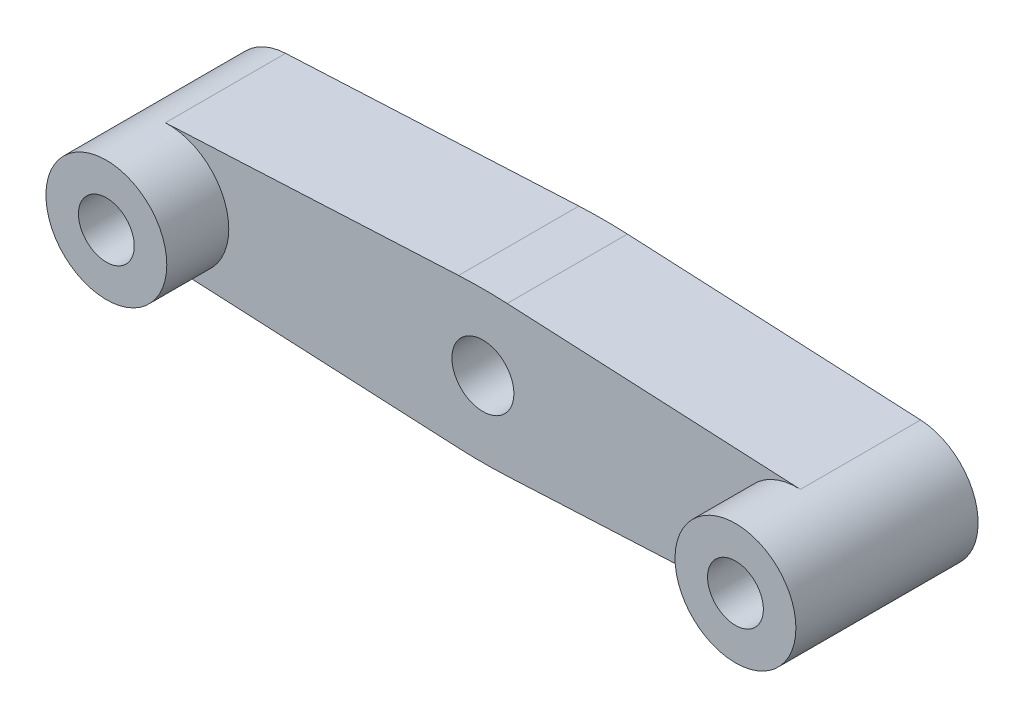
ISO-10303-21;
HEADER;
FILE_DESCRIPTION(('STEP AP214'),'2;1');
FILE_NAME('part.step','',(''),(''),'','','');
FILE_SCHEMA(('AUTOMOTIVE_DESIGN { 1 0 10303 214 1 1 1 1 }'));
ENDSEC;
DATA;
#1=APPLICATION_CONTEXT('core data for automotive mechanical design processes');
#2=APPLICATION_PROTOCOL_DEFINITION('international standard','automotive_design',2000,#1);
#3=PRODUCT_CONTEXT('',#1,'mechanical');
#4=PRODUCT('Part','Part','',(#3));
#5=PRODUCT_RELATED_PRODUCT_CATEGORY('part','',(#4));
#6=PRODUCT_DEFINITION_FORMATION('','',#4);
#7=PRODUCT_DEFINITION_CONTEXT('part definition',#1,'design');
#8=PRODUCT_DEFINITION('design','',#6,#7);
#9=PRODUCT_DEFINITION_SHAPE('','',#8);
#10=(LENGTH_UNIT() NAMED_UNIT(*) SI_UNIT(.MILLI.,.METRE.));
#11=(NAMED_UNIT(*) PLANE_ANGLE_UNIT() SI_UNIT($,.RADIAN.));
#12=(NAMED_UNIT(*) SI_UNIT($,.STERADIAN.) SOLID_ANGLE_UNIT());
#13=UNCERTAINTY_MEASURE_WITH_UNIT(LENGTH_MEASURE(1.E-05),#10,'distance_accuracy_value','');
#14=(GEOMETRIC_REPRESENTATION_CONTEXT(3) GLOBAL_UNCERTAINTY_ASSIGNED_CONTEXT((#13)) GLOBAL_UNIT_ASSIGNED_CONTEXT((#10,
#11,#12)) REPRESENTATION_CONTEXT('',''));
#15=CARTESIAN_POINT('',(0.,0.,0.));
#16=DIRECTION('',(0.,0.,1.));
#17=DIRECTION('',(1.,0.,0.));
#18=AXIS2_PLACEMENT_3D('',#15,#16,#17);
#19=CARTESIAN_POINT('',(0.,0.,0.));
#20=DIRECTION('',(0.,0.,1.));
#21=DIRECTION('',(1.,0.,0.));
#22=AXIS2_PLACEMENT_3D('',#19,#20,#21);
#23=PLANE('',#22);
#24=CARTESIAN_POINT('',(50.75,0.,0.));
#25=DIRECTION('',(0.,0.,-1.));
#26=DIRECTION('',(-1.,0.,0.));
#27=AXIS2_PLACEMENT_3D('',#24,#25,#26);
#28=CIRCLE('',#27,7.5);
#29=CARTESIAN_POINT('',(43.25,0.,0.));
#30=VERTEX_POINT('',#29);
#31=EDGE_CURVE('E214',#30,#30,#28,.T.);
#32=ORIENTED_EDGE('',*,*,#31,.F.);
#33=EDGE_LOOP('',(#32));
#34=FACE_BOUND('',#33,.T.);
#35=CARTESIAN_POINT('',(0.,0.,0.));
#36=DIRECTION('',(0.,0.,1.));
#37=DIRECTION('',(1.,0.,0.));
#38=AXIS2_PLACEMENT_3D('',#35,#36,#37);
#39=CIRCLE('',#38,5.);
#40=CARTESIAN_POINT('',(5.,0.,0.));
#41=VERTEX_POINT('',#40);
#42=EDGE_CURVE('E190',#41,#41,#39,.T.);
#43=ORIENTED_EDGE('',*,*,#42,.T.);
#44=EDGE_LOOP('',(#43));
#45=FACE_BOUND('',#44,.T.);
#46=DIRECTION('',(-0.998800177704476,-0.0489714714656123,0.));
#47=VECTOR('',#46,1.);
#48=CARTESIAN_POINT('',(0.599180751428215,-12.2206219885355,0.));
#49=LINE('',#48,#47);
#50=CARTESIAN_POINT('',(51.2274718467897,-9.73830173261864,0.));
#51=VERTEX_POINT('',#50);
#52=CARTESIAN_POINT('',(3.91771771724899,-12.0579131284883,0.));
#53=VERTEX_POINT('',#52);
#54=EDGE_CURVE('E136',#51,#53,#49,.T.);
#55=ORIENTED_EDGE('',*,*,#54,.T.);
#56=CARTESIAN_POINT('',(0.,67.8461010878698,0.));
#57=DIRECTION('',(0.,0.,1.));
#58=DIRECTION('',(1.,0.,0.));
#59=AXIS2_PLACEMENT_3D('',#56,#57,#58);
#60=CIRCLE('',#59,80.);
#61=CARTESIAN_POINT('',(-3.91771771724899,-12.0579131284883,0.));
#62=VERTEX_POINT('',#61);
#63=EDGE_CURVE('E154',#53,#62,#60,.F.);
#64=ORIENTED_EDGE('',*,*,#63,.T.);
#65=DIRECTION('',(0.998800177704476,-0.0489714714656123,0.));
#66=VECTOR('',#65,1.);
#67=CARTESIAN_POINT('',(-0.599180751428215,-12.2206219885355,0.));
#68=LINE('',#67,#66);
#69=CARTESIAN_POINT('',(-51.2274718467897,-9.73830173261864,0.));
#70=VERTEX_POINT('',#69);
#71=EDGE_CURVE('E133',#70,#62,#68,.T.);
#72=ORIENTED_EDGE('',*,*,#71,.F.);
#73=CARTESIAN_POINT('',(-50.75,0.,0.));
#74=DIRECTION('',(0.,0.,1.));
#75=DIRECTION('',(1.,0.,0.));
#76=AXIS2_PLACEMENT_3D('',#73,#74,#75);
#77=CIRCLE('',#76,9.75);
#78=CARTESIAN_POINT('',(-51.2274718467897,9.73830173261864,0.));
#79=VERTEX_POINT('',#78);
#80=EDGE_CURVE('E130',#79,#70,#77,.T.);
#81=ORIENTED_EDGE('',*,*,#80,.F.);
#82=DIRECTION('',(0.998800177704476,0.0489714714656123,0.));
#83=VECTOR('',#82,1.);
#84=CARTESIAN_POINT('',(-0.599180751428215,12.2206219885355,0.));
#85=LINE('',#84,#83);
#86=CARTESIAN_POINT('',(-3.91771771724899,12.0579131284883,0.));
#87=VERTEX_POINT('',#86);
#88=EDGE_CURVE('E127',#79,#87,#85,.T.);
#89=ORIENTED_EDGE('',*,*,#88,.T.);
#90=CARTESIAN_POINT('',(0.,-67.8461010878698,0.));
#91=DIRECTION('',(0.,0.,1.));
#92=DIRECTION('',(1.,0.,0.));
#93=AXIS2_PLACEMENT_3D('',#90,#91,#92);
#94=CIRCLE('',#93,80.);
#95=CARTESIAN_POINT('',(3.91771771724899,12.0579131284883,0.));
#96=VERTEX_POINT('',#95);
#97=EDGE_CURVE('E152',#87,#96,#94,.F.);
#98=ORIENTED_EDGE('',*,*,#97,.T.);
#99=DIRECTION('',(-0.998800177704476,0.0489714714656123,0.));
#100=VECTOR('',#99,1.);
#101=CARTESIAN_POINT('',(0.599180751428215,12.2206219885355,0.));
#102=LINE('',#101,#100);
#103=CARTESIAN_POINT('',(51.2274718467897,9.73830173261864,0.));
#104=VERTEX_POINT('',#103);
#105=EDGE_CURVE('E140',#104,#96,#102,.T.);
#106=ORIENTED_EDGE('',*,*,#105,.F.);
#107=CARTESIAN_POINT('',(50.75,0.,0.));
#108=DIRECTION('',(0.,0.,1.));
#109=DIRECTION('',(1.,0.,0.));
#110=AXIS2_PLACEMENT_3D('',#107,#108,#109);
#111=CIRCLE('',#110,9.75);
#112=EDGE_CURVE('E117',#104,#51,#111,.F.);
#113=ORIENTED_EDGE('',*,*,#112,.T.);
#114=EDGE_LOOP('',(#55,#64,#72,#81,#89,#98,#106,#113));
#115=FACE_BOUND('',#114,.T.);
#116=CARTESIAN_POINT('',(-50.75,0.,0.));
#117=DIRECTION('',(0.,0.,-1.));
#118=DIRECTION('',(-1.,0.,0.));
#119=AXIS2_PLACEMENT_3D('',#116,#117,#118);
#120=CIRCLE('',#119,7.5);
#121=CARTESIAN_POINT('',(-58.25,0.,0.));
#122=VERTEX_POINT('',#121);
#123=EDGE_CURVE('E202',#122,#122,#120,.T.);
#124=ORIENTED_EDGE('',*,*,#123,.F.);
#125=EDGE_LOOP('',(#124));
#126=FACE_BOUND('',#125,.T.);
#127=ADVANCED_FACE('F36',(#34,#45,#115,#126),#23,.F.);
#128=CARTESIAN_POINT('',(-0.599180751428215,12.2206219885355,19.4));
#129=DIRECTION('',(-0.0489714714656123,0.998800177704476,0.));
#130=DIRECTION('',(-0.998800177704476,-0.0489714714656123,0.));
#131=AXIS2_PLACEMENT_3D('',#128,#129,#130);
#132=PLANE('',#131);
#133=DIRECTION('',(0.998800177704476,0.0489714714656123,0.));
#134=VECTOR('',#133,1.);
#135=CARTESIAN_POINT('',(-0.599180751428215,12.2206219885355,19.4));
#136=LINE('',#135,#134);
#137=CARTESIAN_POINT('',(-51.2274718467897,9.73830173261864,19.4));
#138=VERTEX_POINT('',#137);
#139=CARTESIAN_POINT('',(-3.91771771724899,12.0579131284883,19.4));
#140=VERTEX_POINT('',#139);
#141=EDGE_CURVE('E141',#138,#140,#136,.T.);
#142=ORIENTED_EDGE('',*,*,#141,.T.);
#143=DIRECTION('',(0.,0.,-1.));
#144=VECTOR('',#143,1.);
#145=CARTESIAN_POINT('',(-3.91771771724899,12.0579131284883,0.));
#146=LINE('',#145,#144);
#147=EDGE_CURVE('E44',#140,#87,#146,.T.);
#148=ORIENTED_EDGE('',*,*,#147,.T.);
#149=ORIENTED_EDGE('',*,*,#88,.F.);
#150=DIRECTION('',(0.,0.,-1.));
#151=VECTOR('',#150,1.);
#152=CARTESIAN_POINT('',(-51.2274718467897,9.73830173261864,19.4));
#153=LINE('',#152,#151);
#154=EDGE_CURVE('E147',#138,#79,#153,.T.);
#155=ORIENTED_EDGE('',*,*,#154,.F.);
#156=EDGE_LOOP('',(#142,#148,#149,#155));
#157=FACE_BOUND('',#156,.T.);
#158=ADVANCED_FACE('F164',(#157),#132,.T.);
#159=CARTESIAN_POINT('',(-50.75,0.,19.4));
#160=DIRECTION('',(0.,0.,-1.));
#161=DIRECTION('',(-1.,0.,0.));
#162=AXIS2_PLACEMENT_3D('',#159,#160,#161);
#163=CYLINDRICAL_SURFACE('',#162,9.75);
#164=ORIENTED_EDGE('',*,*,#80,.T.);
#165=DIRECTION('',(0.,0.,-1.));
#166=VECTOR('',#165,1.);
#167=CARTESIAN_POINT('',(-51.2274718467897,-9.73830173261864,19.4));
#168=LINE('',#167,#166);
#169=CARTESIAN_POINT('',(-51.2274718467897,-9.73830173261864,19.4));
#170=VERTEX_POINT('',#169);
#171=EDGE_CURVE('E144',#170,#70,#168,.T.);
#172=ORIENTED_EDGE('',*,*,#171,.F.);
#173=CARTESIAN_POINT('',(-50.75,0.,19.4));
#174=DIRECTION('',(0.,0.,1.));
#175=DIRECTION('',(1.,0.,0.));
#176=AXIS2_PLACEMENT_3D('',#173,#174,#175);
#177=CIRCLE('',#176,9.75);
#178=EDGE_CURVE('E131',#138,#170,#177,.F.);
#179=ORIENTED_EDGE('',*,*,#178,.F.);
#180=ORIENTED_EDGE('',*,*,#154,.T.);
#181=EDGE_LOOP('',(#164,#172,#179,#180));
#182=FACE_BOUND('',#181,.T.);
#183=CARTESIAN_POINT('',(-50.75,0.,29.4));
#184=DIRECTION('',(0.,0.,1.));
#185=DIRECTION('',(1.,0.,0.));
#186=AXIS2_PLACEMENT_3D('',#183,#184,#185);
#187=CIRCLE('',#186,9.75);
#188=CARTESIAN_POINT('',(-41.,0.,29.4));
#189=VERTEX_POINT('',#188);
#190=EDGE_CURVE('E109',#189,#189,#187,.T.);
#191=ORIENTED_EDGE('',*,*,#190,.F.);
#192=EDGE_LOOP('',(#191));
#193=FACE_BOUND('',#192,.T.);
#194=ADVANCED_FACE('F173',(#182,#193),#163,.T.);
#195=CARTESIAN_POINT('',(-0.599180751428215,-12.2206219885355,19.4));
#196=DIRECTION('',(0.0489714714656123,0.998800177704476,0.));
#197=DIRECTION('',(-0.998800177704476,0.0489714714656123,0.));
#198=AXIS2_PLACEMENT_3D('',#195,#196,#197);
#199=PLANE('',#198);
#200=ORIENTED_EDGE('',*,*,#71,.T.);
#201=DIRECTION('',(0.,0.,-1.));
#202=VECTOR('',#201,1.);
#203=CARTESIAN_POINT('',(-3.91771771724899,-12.0579131284883,19.4));
#204=LINE('',#203,#202);
#205=CARTESIAN_POINT('',(-3.91771771724899,-12.0579131284883,19.4));
#206=VERTEX_POINT('',#205);
#207=EDGE_CURVE('E156',#62,#206,#204,.F.);
#208=ORIENTED_EDGE('',*,*,#207,.T.);
#209=DIRECTION('',(0.998800177704476,-0.0489714714656123,0.));
#210=VECTOR('',#209,1.);
#211=CARTESIAN_POINT('',(-0.599180751428215,-12.2206219885355,19.4));
#212=LINE('',#211,#210);
#213=EDGE_CURVE('E123',#170,#206,#212,.T.);
#214=ORIENTED_EDGE('',*,*,#213,.F.);
#215=ORIENTED_EDGE('',*,*,#171,.T.);
#216=EDGE_LOOP('',(#200,#208,#214,#215));
#217=FACE_BOUND('',#216,.T.);
#218=ADVANCED_FACE('F177',(#217),#199,.F.);
#219=CARTESIAN_POINT('',(0.599180751428215,-12.2206219885355,19.4));
#220=DIRECTION('',(0.0489714714656123,-0.998800177704476,0.));
#221=DIRECTION('',(0.998800177704476,0.0489714714656123,0.));
#222=AXIS2_PLACEMENT_3D('',#219,#220,#221);
#223=PLANE('',#222);
#224=DIRECTION('',(-0.998800177704476,-0.0489714714656123,0.));
#225=VECTOR('',#224,1.);
#226=CARTESIAN_POINT('',(0.599180751428215,-12.2206219885355,19.4));
#227=LINE('',#226,#225);
#228=CARTESIAN_POINT('',(51.2274718467897,-9.73830173261864,19.4));
#229=VERTEX_POINT('',#228);
#230=CARTESIAN_POINT('',(3.91771771724899,-12.0579131284883,19.4));
#231=VERTEX_POINT('',#230);
#232=EDGE_CURVE('E106',#229,#231,#227,.T.);
#233=ORIENTED_EDGE('',*,*,#232,.T.);
#234=DIRECTION('',(0.,0.,-1.));
#235=VECTOR('',#234,1.);
#236=CARTESIAN_POINT('',(3.91771771724899,-12.0579131284883,0.));
#237=LINE('',#236,#235);
#238=EDGE_CURVE('E149',#231,#53,#237,.T.);
#239=ORIENTED_EDGE('',*,*,#238,.T.);
#240=ORIENTED_EDGE('',*,*,#54,.F.);
#241=DIRECTION('',(0.,0.,-1.));
#242=VECTOR('',#241,1.);
#243=CARTESIAN_POINT('',(51.2274718467897,-9.73830173261864,19.4));
#244=LINE('',#243,#242);
#245=EDGE_CURVE('E119',#229,#51,#244,.T.);
#246=ORIENTED_EDGE('',*,*,#245,.F.);
#247=EDGE_LOOP('',(#233,#239,#240,#246));
#248=FACE_BOUND('',#247,.T.);
#249=ADVANCED_FACE('F254',(#248),#223,.T.);
#250=CARTESIAN_POINT('',(50.75,0.,19.4));
#251=DIRECTION('',(0.,0.,-1.));
#252=DIRECTION('',(-1.,0.,0.));
#253=AXIS2_PLACEMENT_3D('',#250,#251,#252);
#254=CYLINDRICAL_SURFACE('',#253,9.75);
#255=ORIENTED_EDGE('',*,*,#112,.F.);
#256=DIRECTION('',(0.,0.,-1.));
#257=VECTOR('',#256,1.);
#258=CARTESIAN_POINT('',(51.2274718467897,9.73830173261864,19.4));
#259=LINE('',#258,#257);
#260=CARTESIAN_POINT('',(51.2274718467897,9.73830173261864,19.4));
#261=VERTEX_POINT('',#260);
#262=EDGE_CURVE('E113',#261,#104,#259,.T.);
#263=ORIENTED_EDGE('',*,*,#262,.F.);
#264=CARTESIAN_POINT('',(50.75,0.,19.4));
#265=DIRECTION('',(0.,0.,1.));
#266=DIRECTION('',(1.,0.,0.));
#267=AXIS2_PLACEMENT_3D('',#264,#265,#266);
#268=CIRCLE('',#267,9.75);
#269=EDGE_CURVE('E100',#261,#229,#268,.T.);
#270=ORIENTED_EDGE('',*,*,#269,.T.);
#271=ORIENTED_EDGE('',*,*,#245,.T.);
#272=EDGE_LOOP('',(#255,#263,#270,#271));
#273=FACE_BOUND('',#272,.T.);
#274=CARTESIAN_POINT('',(50.75,0.,29.4));
#275=DIRECTION('',(0.,0.,1.));
#276=DIRECTION('',(1.,0.,0.));
#277=AXIS2_PLACEMENT_3D('',#274,#275,#276);
#278=CIRCLE('',#277,9.75);
#279=CARTESIAN_POINT('',(60.5,0.,29.4));
#280=VERTEX_POINT('',#279);
#281=EDGE_CURVE('E110',#280,#280,#278,.F.);
#282=ORIENTED_EDGE('',*,*,#281,.T.);
#283=EDGE_LOOP('',(#282));
#284=FACE_BOUND('',#283,.T.);
#285=ADVANCED_FACE('F114',(#273,#284),#254,.T.);
#286=CARTESIAN_POINT('',(0.599180751428215,12.2206219885355,19.4));
#287=DIRECTION('',(-0.0489714714656123,-0.998800177704476,0.));
#288=DIRECTION('',(0.998800177704476,-0.0489714714656123,0.));
#289=AXIS2_PLACEMENT_3D('',#286,#287,#288);
#290=PLANE('',#289);
#291=ORIENTED_EDGE('',*,*,#105,.T.);
#292=DIRECTION('',(0.,0.,-1.));
#293=VECTOR('',#292,1.);
#294=CARTESIAN_POINT('',(3.91771771724899,12.0579131284883,19.4));
#295=LINE('',#294,#293);
#296=CARTESIAN_POINT('',(3.91771771724899,12.0579131284883,19.4));
#297=VERTEX_POINT('',#296);
#298=EDGE_CURVE('E11',#96,#297,#295,.F.);
#299=ORIENTED_EDGE('',*,*,#298,.T.);
#300=DIRECTION('',(-0.998800177704476,0.0489714714656123,0.));
#301=VECTOR('',#300,1.);
#302=CARTESIAN_POINT('',(0.599180751428215,12.2206219885355,19.4));
#303=LINE('',#302,#301);
#304=EDGE_CURVE('E104',#261,#297,#303,.T.);
#305=ORIENTED_EDGE('',*,*,#304,.F.);
#306=ORIENTED_EDGE('',*,*,#262,.T.);
#307=EDGE_LOOP('',(#291,#299,#305,#306));
#308=FACE_BOUND('',#307,.T.);
#309=ADVANCED_FACE('F121',(#308),#290,.F.);
#310=CARTESIAN_POINT('',(0.,0.,19.4));
#311=DIRECTION('',(0.,0.,1.));
#312=DIRECTION('',(1.,0.,0.));
#313=AXIS2_PLACEMENT_3D('',#310,#311,#312);
#314=PLANE('',#313);
#315=CARTESIAN_POINT('',(0.,0.,19.4));
#316=DIRECTION('',(0.,0.,1.));
#317=DIRECTION('',(1.,0.,0.));
#318=AXIS2_PLACEMENT_3D('',#315,#316,#317);
#319=CIRCLE('',#318,5.);
#320=CARTESIAN_POINT('',(5.,0.,19.4));
#321=VERTEX_POINT('',#320);
#322=EDGE_CURVE('E187',#321,#321,#319,.F.);
#323=ORIENTED_EDGE('',*,*,#322,.T.);
#324=EDGE_LOOP('',(#323));
#325=FACE_BOUND('',#324,.T.);
#326=ORIENTED_EDGE('',*,*,#213,.T.);
#327=CARTESIAN_POINT('',(0.,67.8461010878698,19.4));
#328=DIRECTION('',(0.,0.,1.));
#329=DIRECTION('',(1.,0.,0.));
#330=AXIS2_PLACEMENT_3D('',#327,#328,#329);
#331=CIRCLE('',#330,80.);
#332=EDGE_CURVE('E159',#206,#231,#331,.T.);
#333=ORIENTED_EDGE('',*,*,#332,.T.);
#334=ORIENTED_EDGE('',*,*,#232,.F.);
#335=ORIENTED_EDGE('',*,*,#269,.F.);
#336=ORIENTED_EDGE('',*,*,#304,.T.);
#337=CARTESIAN_POINT('',(0.,-67.8461010878698,19.4));
#338=DIRECTION('',(0.,0.,1.));
#339=DIRECTION('',(1.,0.,0.));
#340=AXIS2_PLACEMENT_3D('',#337,#338,#339);
#341=CIRCLE('',#340,80.);
#342=EDGE_CURVE('E51',#297,#140,#341,.T.);
#343=ORIENTED_EDGE('',*,*,#342,.T.);
#344=ORIENTED_EDGE('',*,*,#141,.F.);
#345=ORIENTED_EDGE('',*,*,#178,.T.);
#346=EDGE_LOOP('',(#326,#333,#334,#335,#336,#343,#344,#345));
#347=FACE_BOUND('',#346,.T.);
#348=ADVANCED_FACE('F103',(#325,#347),#314,.T.);
#349=CARTESIAN_POINT('',(0.,0.,29.4));
#350=DIRECTION('',(0.,0.,1.));
#351=DIRECTION('',(1.,0.,0.));
#352=AXIS2_PLACEMENT_3D('',#349,#350,#351);
#353=PLANE('',#352);
#354=CARTESIAN_POINT('',(-50.75,0.,29.4));
#355=DIRECTION('',(0.,0.,-1.));
#356=DIRECTION('',(-1.,0.,0.));
#357=AXIS2_PLACEMENT_3D('',#354,#355,#356);
#358=CIRCLE('',#357,4.49999999999999);
#359=CARTESIAN_POINT('',(-55.25,0.,29.4));
#360=VERTEX_POINT('',#359);
#361=EDGE_CURVE('E193',#360,#360,#358,.T.);
#362=ORIENTED_EDGE('',*,*,#361,.T.);
#363=EDGE_LOOP('',(#362));
#364=FACE_BOUND('',#363,.T.);
#365=ORIENTED_EDGE('',*,*,#190,.T.);
#366=EDGE_LOOP('',(#365));
#367=FACE_BOUND('',#366,.T.);
#368=ADVANCED_FACE('F236',(#364,#367),#353,.T.);
#369=CARTESIAN_POINT('',(0.,0.,29.4));
#370=DIRECTION('',(0.,0.,1.));
#371=DIRECTION('',(1.,0.,0.));
#372=AXIS2_PLACEMENT_3D('',#369,#370,#371);
#373=PLANE('',#372);
#374=CARTESIAN_POINT('',(50.75,0.,29.4));
#375=DIRECTION('',(0.,0.,-1.));
#376=DIRECTION('',(-1.,0.,0.));
#377=AXIS2_PLACEMENT_3D('',#374,#375,#376);
#378=CIRCLE('',#377,4.49999999999999);
#379=CARTESIAN_POINT('',(46.25,0.,29.4));
#380=VERTEX_POINT('',#379);
#381=EDGE_CURVE('E205',#380,#380,#378,.T.);
#382=ORIENTED_EDGE('',*,*,#381,.T.);
#383=EDGE_LOOP('',(#382));
#384=FACE_BOUND('',#383,.T.);
#385=ORIENTED_EDGE('',*,*,#281,.F.);
#386=EDGE_LOOP('',(#385));
#387=FACE_BOUND('',#386,.T.);
#388=ADVANCED_FACE('F228',(#384,#387),#373,.T.);
#389=CARTESIAN_POINT('',(0.,0.,29.4));
#390=DIRECTION('',(0.,0.,-1.));
#391=DIRECTION('',(-1.,0.,0.));
#392=AXIS2_PLACEMENT_3D('',#389,#390,#391);
#393=CYLINDRICAL_SURFACE('',#392,5.);
#394=ORIENTED_EDGE('',*,*,#322,.F.);
#395=EDGE_LOOP('',(#394));
#396=FACE_BOUND('',#395,.T.);
#397=ORIENTED_EDGE('',*,*,#42,.F.);
#398=EDGE_LOOP('',(#397));
#399=FACE_BOUND('',#398,.T.);
#400=ADVANCED_FACE('F225',(#396,#399),#393,.F.);
#401=CARTESIAN_POINT('',(0.,67.8461010878698,19.4));
#402=DIRECTION('',(0.,0.,1.));
#403=DIRECTION('',(1.,0.,0.));
#404=AXIS2_PLACEMENT_3D('',#401,#402,#403);
#405=CYLINDRICAL_SURFACE('',#404,80.);
#406=ORIENTED_EDGE('',*,*,#332,.F.);
#407=ORIENTED_EDGE('',*,*,#207,.F.);
#408=ORIENTED_EDGE('',*,*,#63,.F.);
#409=ORIENTED_EDGE('',*,*,#238,.F.);
#410=EDGE_LOOP('',(#406,#407,#408,#409));
#411=FACE_BOUND('',#410,.T.);
#412=ADVANCED_FACE('F227',(#411),#405,.T.);
#413=CARTESIAN_POINT('',(0.,-67.8461010878698,19.4));
#414=DIRECTION('',(0.,0.,1.));
#415=DIRECTION('',(1.,0.,0.));
#416=AXIS2_PLACEMENT_3D('',#413,#414,#415);
#417=CYLINDRICAL_SURFACE('',#416,80.);
#418=ORIENTED_EDGE('',*,*,#342,.F.);
#419=ORIENTED_EDGE('',*,*,#298,.F.);
#420=ORIENTED_EDGE('',*,*,#97,.F.);
#421=ORIENTED_EDGE('',*,*,#147,.F.);
#422=EDGE_LOOP('',(#418,#419,#420,#421));
#423=FACE_BOUND('',#422,.T.);
#424=ADVANCED_FACE('F38',(#423),#417,.T.);
#425=CARTESIAN_POINT('',(-50.75,0.,0.));
#426=DIRECTION('',(0.,0.,-1.));
#427=DIRECTION('',(-1.,0.,0.));
#428=AXIS2_PLACEMENT_3D('',#425,#426,#427);
#429=CYLINDRICAL_SURFACE('',#428,4.49999999999999);
#430=ORIENTED_EDGE('',*,*,#361,.F.);
#431=EDGE_LOOP('',(#430));
#432=FACE_BOUND('',#431,.T.);
#433=CARTESIAN_POINT('',(-50.75,0.,8.));
#434=DIRECTION('',(0.,0.,-1.));
#435=DIRECTION('',(-1.,0.,0.));
#436=AXIS2_PLACEMENT_3D('',#433,#434,#435);
#437=CIRCLE('',#436,4.5);
#438=CARTESIAN_POINT('',(-55.25,0.,8.));
#439=VERTEX_POINT('',#438);
#440=EDGE_CURVE('E196',#439,#439,#437,.T.);
#441=ORIENTED_EDGE('',*,*,#440,.T.);
#442=EDGE_LOOP('',(#441));
#443=FACE_BOUND('',#442,.T.);
#444=ADVANCED_FACE('F241',(#432,#443),#429,.F.);
#445=CARTESIAN_POINT('',(-46.25,0.,8.));
#446=DIRECTION('',(0.,0.,1.));
#447=DIRECTION('',(1.,0.,0.));
#448=AXIS2_PLACEMENT_3D('',#445,#446,#447);
#449=PLANE('',#448);
#450=ORIENTED_EDGE('',*,*,#440,.F.);
#451=EDGE_LOOP('',(#450));
#452=FACE_BOUND('',#451,.T.);
#453=CARTESIAN_POINT('',(-50.75,0.,8.));
#454=DIRECTION('',(0.,0.,-1.));
#455=DIRECTION('',(-1.,0.,0.));
#456=AXIS2_PLACEMENT_3D('',#453,#454,#455);
#457=CIRCLE('',#456,7.5);
#458=CARTESIAN_POINT('',(-58.25,0.,8.));
#459=VERTEX_POINT('',#458);
#460=EDGE_CURVE('E199',#459,#459,#457,.T.);
#461=ORIENTED_EDGE('',*,*,#460,.T.);
#462=EDGE_LOOP('',(#461));
#463=FACE_BOUND('',#462,.T.);
#464=ADVANCED_FACE('F310',(#452,#463),#449,.F.);
#465=CARTESIAN_POINT('',(-50.75,0.,0.));
#466=DIRECTION('',(0.,0.,-1.));
#467=DIRECTION('',(-1.,0.,0.));
#468=AXIS2_PLACEMENT_3D('',#465,#466,#467);
#469=CYLINDRICAL_SURFACE('',#468,7.5);
#470=ORIENTED_EDGE('',*,*,#460,.F.);
#471=EDGE_LOOP('',(#470));
#472=FACE_BOUND('',#471,.T.);
#473=ORIENTED_EDGE('',*,*,#123,.T.);
#474=EDGE_LOOP('',(#473));
#475=FACE_BOUND('',#474,.T.);
#476=ADVANCED_FACE('F321',(#472,#475),#469,.F.);
#477=CARTESIAN_POINT('',(50.75,0.,0.));
#478=DIRECTION('',(0.,0.,-1.));
#479=DIRECTION('',(-1.,0.,0.));
#480=AXIS2_PLACEMENT_3D('',#477,#478,#479);
#481=CYLINDRICAL_SURFACE('',#480,4.49999999999999);
#482=ORIENTED_EDGE('',*,*,#381,.F.);
#483=EDGE_LOOP('',(#482));
#484=FACE_BOUND('',#483,.T.);
#485=CARTESIAN_POINT('',(50.75,0.,8.));
#486=DIRECTION('',(0.,0.,-1.));
#487=DIRECTION('',(-1.,0.,0.));
#488=AXIS2_PLACEMENT_3D('',#485,#486,#487);
#489=CIRCLE('',#488,4.5);
#490=CARTESIAN_POINT('',(46.25,0.,8.));
#491=VERTEX_POINT('',#490);
#492=EDGE_CURVE('E208',#491,#491,#489,.T.);
#493=ORIENTED_EDGE('',*,*,#492,.T.);
#494=EDGE_LOOP('',(#493));
#495=FACE_BOUND('',#494,.T.);
#496=ADVANCED_FACE('F330',(#484,#495),#481,.F.);
#497=CARTESIAN_POINT('',(55.25,0.,8.));
#498=DIRECTION('',(0.,0.,1.));
#499=DIRECTION('',(1.,0.,0.));
#500=AXIS2_PLACEMENT_3D('',#497,#498,#499);
#501=PLANE('',#500);
#502=ORIENTED_EDGE('',*,*,#492,.F.);
#503=EDGE_LOOP('',(#502));
#504=FACE_BOUND('',#503,.T.);
#505=CARTESIAN_POINT('',(50.75,0.,8.));
#506=DIRECTION('',(0.,0.,-1.));
#507=DIRECTION('',(-1.,0.,0.));
#508=AXIS2_PLACEMENT_3D('',#505,#506,#507);
#509=CIRCLE('',#508,7.5);
#510=CARTESIAN_POINT('',(43.25,0.,8.));
#511=VERTEX_POINT('',#510);
#512=EDGE_CURVE('E211',#511,#511,#509,.T.);
#513=ORIENTED_EDGE('',*,*,#512,.T.);
#514=EDGE_LOOP('',(#513));
#515=FACE_BOUND('',#514,.T.);
#516=ADVANCED_FACE('F340',(#504,#515),#501,.F.);
#517=CARTESIAN_POINT('',(50.75,0.,0.));
#518=DIRECTION('',(0.,0.,-1.));
#519=DIRECTION('',(-1.,0.,0.));
#520=AXIS2_PLACEMENT_3D('',#517,#518,#519);
#521=CYLINDRICAL_SURFACE('',#520,7.5);
#522=ORIENTED_EDGE('',*,*,#512,.F.);
#523=EDGE_LOOP('',(#522));
#524=FACE_BOUND('',#523,.T.);
#525=ORIENTED_EDGE('',*,*,#31,.T.);
#526=EDGE_LOOP('',(#525));
#527=FACE_BOUND('',#526,.T.);
#528=ADVANCED_FACE('F218',(#524,#527),#521,.F.);
#529=CLOSED_SHELL('',(#127,#158,#194,#218,#249,#285,#309,#348,#368,#388,#400,#412,#424,#444,
#464,#476,#496,#516,#528));
#530=MANIFOLD_SOLID_BREP('B2',#529);
#531=ADVANCED_BREP_SHAPE_REPRESENTATION('',(#18,#530),#14);
#532=SHAPE_DEFINITION_REPRESENTATION(#9,#531);
ENDSEC;
END-ISO-10303-21;
